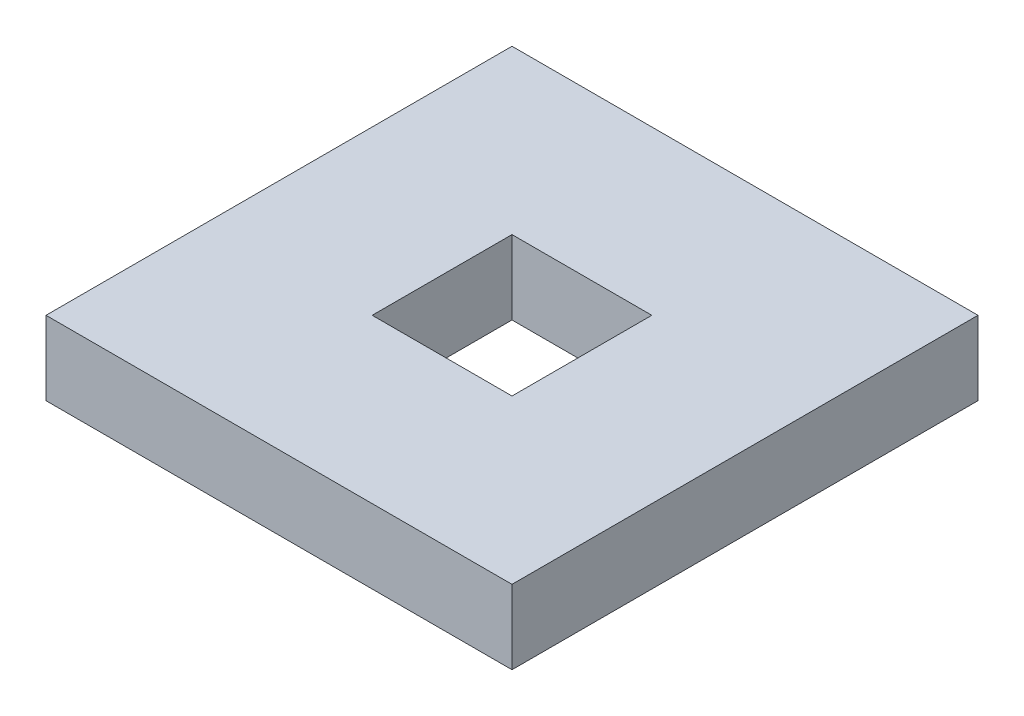
ISO-10303-21;
HEADER;
FILE_DESCRIPTION(('STEP AP214'),'2;1');
FILE_NAME('part.step','',(''),(''),'','','');
FILE_SCHEMA(('AUTOMOTIVE_DESIGN { 1 0 10303 214 1 1 1 1 }'));
ENDSEC;
DATA;
#1=APPLICATION_CONTEXT('core data for automotive mechanical design processes');
#2=APPLICATION_PROTOCOL_DEFINITION('international standard','automotive_design',2000,#1);
#3=PRODUCT_CONTEXT('',#1,'mechanical');
#4=PRODUCT('Part','Part','',(#3));
#5=PRODUCT_RELATED_PRODUCT_CATEGORY('part','',(#4));
#6=PRODUCT_DEFINITION_FORMATION('','',#4);
#7=PRODUCT_DEFINITION_CONTEXT('part definition',#1,'design');
#8=PRODUCT_DEFINITION('design','',#6,#7);
#9=PRODUCT_DEFINITION_SHAPE('','',#8);
#10=(LENGTH_UNIT() NAMED_UNIT(*) SI_UNIT(.MILLI.,.METRE.));
#11=(NAMED_UNIT(*) PLANE_ANGLE_UNIT() SI_UNIT($,.RADIAN.));
#12=(NAMED_UNIT(*) SI_UNIT($,.STERADIAN.) SOLID_ANGLE_UNIT());
#13=UNCERTAINTY_MEASURE_WITH_UNIT(LENGTH_MEASURE(1.E-05),#10,'distance_accuracy_value','');
#14=(GEOMETRIC_REPRESENTATION_CONTEXT(3) GLOBAL_UNCERTAINTY_ASSIGNED_CONTEXT((#13)) GLOBAL_UNIT_ASSIGNED_CONTEXT((#10,
#11,#12)) REPRESENTATION_CONTEXT('',''));
#15=CARTESIAN_POINT('',(0.,0.,0.));
#16=DIRECTION('',(0.,0.,1.));
#17=DIRECTION('',(1.,0.,0.));
#18=AXIS2_PLACEMENT_3D('',#15,#16,#17);
#19=CARTESIAN_POINT('',(0.,6.35,0.));
#20=DIRECTION('',(0.,1.,0.));
#21=DIRECTION('',(0.,0.,1.));
#22=AXIS2_PLACEMENT_3D('',#19,#20,#21);
#23=PLANE('',#22);
#24=DIRECTION('',(0.,0.,1.));
#25=VECTOR('',#24,1.);
#26=CARTESIAN_POINT('',(-20.,6.35,20.));
#27=LINE('',#26,#25);
#28=CARTESIAN_POINT('',(-20.,6.35,-20.));
#29=VERTEX_POINT('',#28);
#30=CARTESIAN_POINT('',(-20.,6.35,20.));
#31=VERTEX_POINT('',#30);
#32=EDGE_CURVE('E134',#29,#31,#27,.T.);
#33=ORIENTED_EDGE('',*,*,#32,.T.);
#34=DIRECTION('',(1.,0.,0.));
#35=VECTOR('',#34,1.);
#36=CARTESIAN_POINT('',(20.,6.35,20.));
#37=LINE('',#36,#35);
#38=CARTESIAN_POINT('',(20.,6.35,20.));
#39=VERTEX_POINT('',#38);
#40=EDGE_CURVE('E137',#31,#39,#37,.T.);
#41=ORIENTED_EDGE('',*,*,#40,.T.);
#42=DIRECTION('',(0.,0.,-1.));
#43=VECTOR('',#42,1.);
#44=CARTESIAN_POINT('',(20.,6.35,20.));
#45=LINE('',#44,#43);
#46=CARTESIAN_POINT('',(20.,6.35,-20.));
#47=VERTEX_POINT('',#46);
#48=EDGE_CURVE('E140',#39,#47,#45,.T.);
#49=ORIENTED_EDGE('',*,*,#48,.T.);
#50=DIRECTION('',(-1.,0.,0.));
#51=VECTOR('',#50,1.);
#52=CARTESIAN_POINT('',(20.,6.35,-20.));
#53=LINE('',#52,#51);
#54=EDGE_CURVE('E142',#47,#29,#53,.T.);
#55=ORIENTED_EDGE('',*,*,#54,.T.);
#56=EDGE_LOOP('',(#33,#41,#49,#55));
#57=FACE_BOUND('',#56,.T.);
#58=DIRECTION('',(-1.,0.,0.));
#59=VECTOR('',#58,1.);
#60=CARTESIAN_POINT('',(-6.00000000000002,6.35,-6.));
#61=LINE('',#60,#59);
#62=CARTESIAN_POINT('',(5.99999999999999,6.35,-6.));
#63=VERTEX_POINT('',#62);
#64=CARTESIAN_POINT('',(-6.00000000000002,6.35,-6.));
#65=VERTEX_POINT('',#64);
#66=EDGE_CURVE('E106',#63,#65,#61,.T.);
#67=ORIENTED_EDGE('',*,*,#66,.F.);
#68=DIRECTION('',(0.,0.,-1.));
#69=VECTOR('',#68,1.);
#70=CARTESIAN_POINT('',(5.99999999999999,6.35,6.));
#71=LINE('',#70,#69);
#72=CARTESIAN_POINT('',(5.99999999999999,6.35,6.));
#73=VERTEX_POINT('',#72);
#74=EDGE_CURVE('E98',#73,#63,#71,.T.);
#75=ORIENTED_EDGE('',*,*,#74,.F.);
#76=DIRECTION('',(1.,0.,0.));
#77=VECTOR('',#76,1.);
#78=CARTESIAN_POINT('',(-6.00000000000002,6.35,6.));
#79=LINE('',#78,#77);
#80=CARTESIAN_POINT('',(-6.00000000000002,6.35,6.));
#81=VERTEX_POINT('',#80);
#82=EDGE_CURVE('E120',#81,#73,#79,.T.);
#83=ORIENTED_EDGE('',*,*,#82,.F.);
#84=DIRECTION('',(0.,0.,1.));
#85=VECTOR('',#84,1.);
#86=CARTESIAN_POINT('',(-6.00000000000002,6.35,6.));
#87=LINE('',#86,#85);
#88=EDGE_CURVE('E118',#65,#81,#87,.T.);
#89=ORIENTED_EDGE('',*,*,#88,.F.);
#90=EDGE_LOOP('',(#67,#75,#83,#89));
#91=FACE_BOUND('',#90,.T.);
#92=ADVANCED_FACE('F33',(#57,#91),#23,.T.);
#93=CARTESIAN_POINT('',(0.,0.,0.));
#94=DIRECTION('',(0.,1.,0.));
#95=DIRECTION('',(0.,0.,1.));
#96=AXIS2_PLACEMENT_3D('',#93,#94,#95);
#97=PLANE('',#96);
#98=DIRECTION('',(0.,0.,1.));
#99=VECTOR('',#98,1.);
#100=CARTESIAN_POINT('',(-20.,0.,20.));
#101=LINE('',#100,#99);
#102=CARTESIAN_POINT('',(-20.,0.,-20.));
#103=VERTEX_POINT('',#102);
#104=CARTESIAN_POINT('',(-20.,0.,20.));
#105=VERTEX_POINT('',#104);
#106=EDGE_CURVE('E114',#103,#105,#101,.T.);
#107=ORIENTED_EDGE('',*,*,#106,.F.);
#108=DIRECTION('',(-1.,0.,0.));
#109=VECTOR('',#108,1.);
#110=CARTESIAN_POINT('',(20.,0.,-20.));
#111=LINE('',#110,#109);
#112=CARTESIAN_POINT('',(20.,0.,-20.));
#113=VERTEX_POINT('',#112);
#114=EDGE_CURVE('E138',#113,#103,#111,.T.);
#115=ORIENTED_EDGE('',*,*,#114,.F.);
#116=DIRECTION('',(0.,0.,-1.));
#117=VECTOR('',#116,1.);
#118=CARTESIAN_POINT('',(20.,0.,20.));
#119=LINE('',#118,#117);
#120=CARTESIAN_POINT('',(20.,0.,20.));
#121=VERTEX_POINT('',#120);
#122=EDGE_CURVE('E149',#121,#113,#119,.T.);
#123=ORIENTED_EDGE('',*,*,#122,.F.);
#124=DIRECTION('',(1.,0.,0.));
#125=VECTOR('',#124,1.);
#126=CARTESIAN_POINT('',(20.,0.,20.));
#127=LINE('',#126,#125);
#128=EDGE_CURVE('E147',#105,#121,#127,.T.);
#129=ORIENTED_EDGE('',*,*,#128,.F.);
#130=EDGE_LOOP('',(#107,#115,#123,#129));
#131=FACE_BOUND('',#130,.T.);
#132=DIRECTION('',(0.,0.,-1.));
#133=VECTOR('',#132,1.);
#134=CARTESIAN_POINT('',(5.99999999999999,0.,6.));
#135=LINE('',#134,#133);
#136=CARTESIAN_POINT('',(5.99999999999999,0.,6.));
#137=VERTEX_POINT('',#136);
#138=CARTESIAN_POINT('',(5.99999999999999,0.,-6.));
#139=VERTEX_POINT('',#138);
#140=EDGE_CURVE('E56',#137,#139,#135,.T.);
#141=ORIENTED_EDGE('',*,*,#140,.T.);
#142=DIRECTION('',(-1.,0.,0.));
#143=VECTOR('',#142,1.);
#144=CARTESIAN_POINT('',(-6.00000000000002,0.,-6.));
#145=LINE('',#144,#143);
#146=CARTESIAN_POINT('',(-6.00000000000002,0.,-6.));
#147=VERTEX_POINT('',#146);
#148=EDGE_CURVE('E113',#139,#147,#145,.T.);
#149=ORIENTED_EDGE('',*,*,#148,.T.);
#150=DIRECTION('',(0.,0.,1.));
#151=VECTOR('',#150,1.);
#152=CARTESIAN_POINT('',(-6.00000000000002,0.,6.));
#153=LINE('',#152,#151);
#154=CARTESIAN_POINT('',(-6.00000000000002,0.,6.));
#155=VERTEX_POINT('',#154);
#156=EDGE_CURVE('E126',#147,#155,#153,.T.);
#157=ORIENTED_EDGE('',*,*,#156,.T.);
#158=DIRECTION('',(1.,0.,0.));
#159=VECTOR('',#158,1.);
#160=CARTESIAN_POINT('',(-6.00000000000002,0.,6.));
#161=LINE('',#160,#159);
#162=EDGE_CURVE('E107',#155,#137,#161,.T.);
#163=ORIENTED_EDGE('',*,*,#162,.T.);
#164=EDGE_LOOP('',(#141,#149,#157,#163));
#165=FACE_BOUND('',#164,.T.);
#166=ADVANCED_FACE('F167',(#131,#165),#97,.F.);
#167=CARTESIAN_POINT('',(-20.,6.35,20.));
#168=DIRECTION('',(1.,0.,0.));
#169=DIRECTION('',(0.,0.,-1.));
#170=AXIS2_PLACEMENT_3D('',#167,#168,#169);
#171=PLANE('',#170);
#172=ORIENTED_EDGE('',*,*,#106,.T.);
#173=DIRECTION('',(0.,-1.,0.));
#174=VECTOR('',#173,1.);
#175=CARTESIAN_POINT('',(-20.,6.35,20.));
#176=LINE('',#175,#174);
#177=EDGE_CURVE('E11',#31,#105,#176,.T.);
#178=ORIENTED_EDGE('',*,*,#177,.F.);
#179=ORIENTED_EDGE('',*,*,#32,.F.);
#180=DIRECTION('',(0.,-1.,0.));
#181=VECTOR('',#180,1.);
#182=CARTESIAN_POINT('',(-20.,6.35,-20.));
#183=LINE('',#182,#181);
#184=EDGE_CURVE('E144',#29,#103,#183,.T.);
#185=ORIENTED_EDGE('',*,*,#184,.T.);
#186=EDGE_LOOP('',(#172,#178,#179,#185));
#187=FACE_BOUND('',#186,.T.);
#188=ADVANCED_FACE('F35',(#187),#171,.F.);
#189=CARTESIAN_POINT('',(20.,6.35,20.));
#190=DIRECTION('',(0.,0.,-1.));
#191=DIRECTION('',(-1.,0.,0.));
#192=AXIS2_PLACEMENT_3D('',#189,#190,#191);
#193=PLANE('',#192);
#194=ORIENTED_EDGE('',*,*,#128,.T.);
#195=DIRECTION('',(0.,-1.,0.));
#196=VECTOR('',#195,1.);
#197=CARTESIAN_POINT('',(20.,6.35,20.));
#198=LINE('',#197,#196);
#199=EDGE_CURVE('E41',#39,#121,#198,.T.);
#200=ORIENTED_EDGE('',*,*,#199,.F.);
#201=ORIENTED_EDGE('',*,*,#40,.F.);
#202=ORIENTED_EDGE('',*,*,#177,.T.);
#203=EDGE_LOOP('',(#194,#200,#201,#202));
#204=FACE_BOUND('',#203,.T.);
#205=ADVANCED_FACE('F177',(#204),#193,.F.);
#206=CARTESIAN_POINT('',(20.,6.35,20.));
#207=DIRECTION('',(-1.,0.,0.));
#208=DIRECTION('',(0.,0.,1.));
#209=AXIS2_PLACEMENT_3D('',#206,#207,#208);
#210=PLANE('',#209);
#211=ORIENTED_EDGE('',*,*,#122,.T.);
#212=DIRECTION('',(0.,-1.,0.));
#213=VECTOR('',#212,1.);
#214=CARTESIAN_POINT('',(20.,6.35,-20.));
#215=LINE('',#214,#213);
#216=EDGE_CURVE('E154',#47,#113,#215,.T.);
#217=ORIENTED_EDGE('',*,*,#216,.F.);
#218=ORIENTED_EDGE('',*,*,#48,.F.);
#219=ORIENTED_EDGE('',*,*,#199,.T.);
#220=EDGE_LOOP('',(#211,#217,#218,#219));
#221=FACE_BOUND('',#220,.T.);
#222=ADVANCED_FACE('F161',(#221),#210,.F.);
#223=CARTESIAN_POINT('',(20.,6.35,-20.));
#224=DIRECTION('',(0.,0.,1.));
#225=DIRECTION('',(1.,0.,0.));
#226=AXIS2_PLACEMENT_3D('',#223,#224,#225);
#227=PLANE('',#226);
#228=ORIENTED_EDGE('',*,*,#114,.T.);
#229=ORIENTED_EDGE('',*,*,#184,.F.);
#230=ORIENTED_EDGE('',*,*,#54,.F.);
#231=ORIENTED_EDGE('',*,*,#216,.T.);
#232=EDGE_LOOP('',(#228,#229,#230,#231));
#233=FACE_BOUND('',#232,.T.);
#234=ADVANCED_FACE('F171',(#233),#227,.F.);
#235=CARTESIAN_POINT('',(5.99999999999999,6.35,6.));
#236=DIRECTION('',(-1.,0.,0.));
#237=DIRECTION('',(0.,0.,1.));
#238=AXIS2_PLACEMENT_3D('',#235,#236,#237);
#239=PLANE('',#238);
#240=ORIENTED_EDGE('',*,*,#140,.F.);
#241=DIRECTION('',(0.,-1.,0.));
#242=VECTOR('',#241,1.);
#243=CARTESIAN_POINT('',(5.99999999999999,6.35,6.));
#244=LINE('',#243,#242);
#245=EDGE_CURVE('E102',#73,#137,#244,.T.);
#246=ORIENTED_EDGE('',*,*,#245,.F.);
#247=ORIENTED_EDGE('',*,*,#74,.T.);
#248=DIRECTION('',(0.,-1.,0.));
#249=VECTOR('',#248,1.);
#250=CARTESIAN_POINT('',(5.99999999999999,6.35,-6.));
#251=LINE('',#250,#249);
#252=EDGE_CURVE('E101',#63,#139,#251,.T.);
#253=ORIENTED_EDGE('',*,*,#252,.T.);
#254=EDGE_LOOP('',(#240,#246,#247,#253));
#255=FACE_BOUND('',#254,.T.);
#256=ADVANCED_FACE('F100',(#255),#239,.T.);
#257=CARTESIAN_POINT('',(-6.00000000000002,6.35,-6.));
#258=DIRECTION('',(0.,0.,1.));
#259=DIRECTION('',(1.,0.,0.));
#260=AXIS2_PLACEMENT_3D('',#257,#258,#259);
#261=PLANE('',#260);
#262=ORIENTED_EDGE('',*,*,#148,.F.);
#263=ORIENTED_EDGE('',*,*,#252,.F.);
#264=ORIENTED_EDGE('',*,*,#66,.T.);
#265=DIRECTION('',(0.,-1.,0.));
#266=VECTOR('',#265,1.);
#267=CARTESIAN_POINT('',(-6.00000000000002,6.35,-6.));
#268=LINE('',#267,#266);
#269=EDGE_CURVE('E115',#65,#147,#268,.T.);
#270=ORIENTED_EDGE('',*,*,#269,.T.);
#271=EDGE_LOOP('',(#262,#263,#264,#270));
#272=FACE_BOUND('',#271,.T.);
#273=ADVANCED_FACE('F110',(#272),#261,.T.);
#274=CARTESIAN_POINT('',(-6.00000000000002,6.35,6.));
#275=DIRECTION('',(1.,0.,0.));
#276=DIRECTION('',(0.,0.,-1.));
#277=AXIS2_PLACEMENT_3D('',#274,#275,#276);
#278=PLANE('',#277);
#279=ORIENTED_EDGE('',*,*,#156,.F.);
#280=ORIENTED_EDGE('',*,*,#269,.F.);
#281=ORIENTED_EDGE('',*,*,#88,.T.);
#282=DIRECTION('',(0.,-1.,0.));
#283=VECTOR('',#282,1.);
#284=CARTESIAN_POINT('',(-6.00000000000002,6.35,6.));
#285=LINE('',#284,#283);
#286=EDGE_CURVE('E48',#81,#155,#285,.T.);
#287=ORIENTED_EDGE('',*,*,#286,.T.);
#288=EDGE_LOOP('',(#279,#280,#281,#287));
#289=FACE_BOUND('',#288,.T.);
#290=ADVANCED_FACE('F200',(#289),#278,.T.);
#291=CARTESIAN_POINT('',(-6.00000000000002,6.35,6.));
#292=DIRECTION('',(0.,0.,-1.));
#293=DIRECTION('',(-1.,0.,0.));
#294=AXIS2_PLACEMENT_3D('',#291,#292,#293);
#295=PLANE('',#294);
#296=ORIENTED_EDGE('',*,*,#162,.F.);
#297=ORIENTED_EDGE('',*,*,#286,.F.);
#298=ORIENTED_EDGE('',*,*,#82,.T.);
#299=ORIENTED_EDGE('',*,*,#245,.T.);
#300=EDGE_LOOP('',(#296,#297,#298,#299));
#301=FACE_BOUND('',#300,.T.);
#302=ADVANCED_FACE('F204',(#301),#295,.T.);
#303=CLOSED_SHELL('',(#92,#166,#188,#205,#222,#234,#256,#273,#290,#302));
#304=MANIFOLD_SOLID_BREP('B2',#303);
#305=ADVANCED_BREP_SHAPE_REPRESENTATION('',(#18,#304),#14);
#306=SHAPE_DEFINITION_REPRESENTATION(#9,#305);
ENDSEC;
END-ISO-10303-21;
